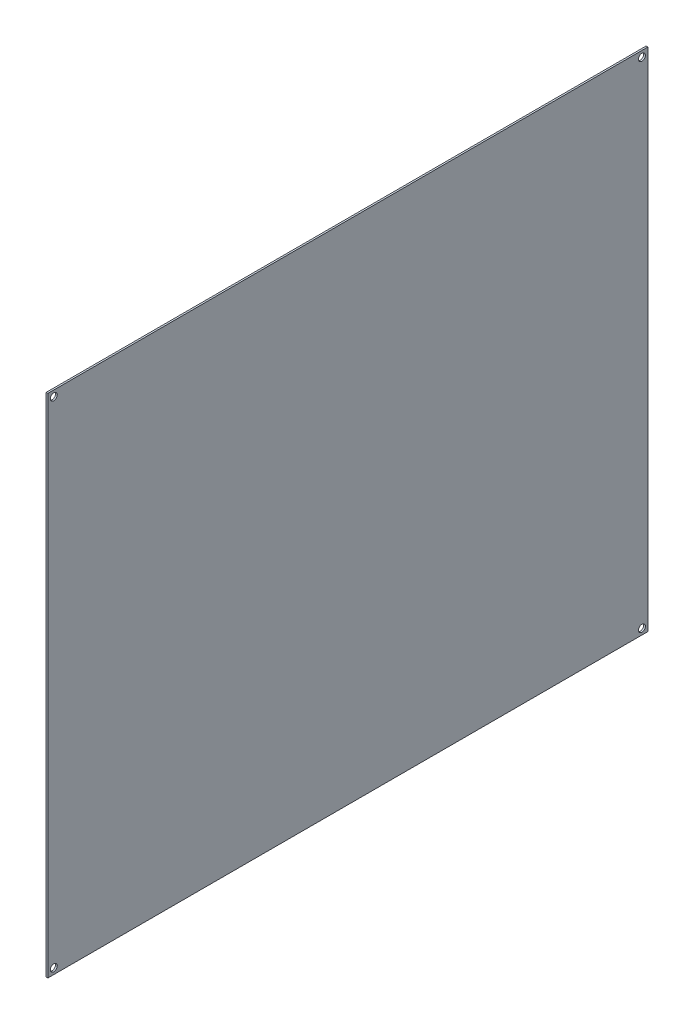
ISO-10303-21;
HEADER;
FILE_DESCRIPTION(('STEP AP214'),'2;1');
FILE_NAME('part.step','',(''),(''),'','','');
FILE_SCHEMA(('AUTOMOTIVE_DESIGN { 1 0 10303 214 1 1 1 1 }'));
ENDSEC;
DATA;
#1=APPLICATION_CONTEXT('core data for automotive mechanical design processes');
#2=APPLICATION_PROTOCOL_DEFINITION('international standard','automotive_design',2000,#1);
#3=PRODUCT_CONTEXT('',#1,'mechanical');
#4=PRODUCT('Part','Part','',(#3));
#5=PRODUCT_RELATED_PRODUCT_CATEGORY('part','',(#4));
#6=PRODUCT_DEFINITION_FORMATION('','',#4);
#7=PRODUCT_DEFINITION_CONTEXT('part definition',#1,'design');
#8=PRODUCT_DEFINITION('design','',#6,#7);
#9=PRODUCT_DEFINITION_SHAPE('','',#8);
#10=(LENGTH_UNIT() NAMED_UNIT(*) SI_UNIT(.MILLI.,.METRE.));
#11=(NAMED_UNIT(*) PLANE_ANGLE_UNIT() SI_UNIT($,.RADIAN.));
#12=(NAMED_UNIT(*) SI_UNIT($,.STERADIAN.) SOLID_ANGLE_UNIT());
#13=UNCERTAINTY_MEASURE_WITH_UNIT(LENGTH_MEASURE(1.E-05),#10,'distance_accuracy_value','');
#14=(GEOMETRIC_REPRESENTATION_CONTEXT(3) GLOBAL_UNCERTAINTY_ASSIGNED_CONTEXT((#13)) GLOBAL_UNIT_ASSIGNED_CONTEXT((#10,
#11,#12)) REPRESENTATION_CONTEXT('',''));
#15=CARTESIAN_POINT('',(0.,0.,0.));
#16=DIRECTION('',(0.,0.,1.));
#17=DIRECTION('',(1.,0.,0.));
#18=AXIS2_PLACEMENT_3D('',#15,#16,#17);
#19=CARTESIAN_POINT('',(-874.727954017006,506.100440858387,-40.1000000707061));
#20=DIRECTION('',(-1.,0.,0.));
#21=DIRECTION('',(0.,0.,1.));
#22=AXIS2_PLACEMENT_3D('',#19,#20,#21);
#23=PLANE('',#22);
#24=CARTESIAN_POINT('',(-874.727954017006,45.5410317771945,-45.54103200034));
#25=DIRECTION('',(-1.,0.,0.));
#26=DIRECTION('',(0.,0.,1.));
#27=AXIS2_PLACEMENT_3D('',#24,#25,#26);
#28=CIRCLE('',#27,3.175);
#29=CARTESIAN_POINT('',(-874.727954017006,45.5410317771945,-42.36603200034));
#30=VERTEX_POINT('',#29);
#31=EDGE_CURVE('E120',#30,#30,#28,.T.);
#32=ORIENTED_EDGE('',*,*,#31,.F.);
#33=EDGE_LOOP('',(#32));
#34=FACE_BOUND('',#33,.T.);
#35=CARTESIAN_POINT('',(-874.727954017006,500.65896799963,-586.858968152126));
#36=DIRECTION('',(-1.,0.,0.));
#37=DIRECTION('',(0.,0.,1.));
#38=AXIS2_PLACEMENT_3D('',#35,#36,#37);
#39=CIRCLE('',#38,3.17500000000008);
#40=CARTESIAN_POINT('',(-874.727954017006,500.65896799963,-583.683968152126));
#41=VERTEX_POINT('',#40);
#42=EDGE_CURVE('E99',#41,#41,#39,.T.);
#43=ORIENTED_EDGE('',*,*,#42,.F.);
#44=EDGE_LOOP('',(#43));
#45=FACE_BOUND('',#44,.T.);
#46=DIRECTION('',(0.,0.,-1.));
#47=VECTOR('',#46,1.);
#48=CARTESIAN_POINT('',(-874.727954017006,506.100440858387,-592.299999929332));
#49=LINE('',#48,#47);
#50=CARTESIAN_POINT('',(-874.727954017006,506.100440858387,-40.1000000707061));
#51=VERTEX_POINT('',#50);
#52=CARTESIAN_POINT('',(-874.727954017006,506.100440858387,-592.299999929332));
#53=VERTEX_POINT('',#52);
#54=EDGE_CURVE('E84',#51,#53,#49,.T.);
#55=ORIENTED_EDGE('',*,*,#54,.T.);
#56=DIRECTION('',(0.,-1.,0.));
#57=VECTOR('',#56,1.);
#58=CARTESIAN_POINT('',(-874.727954017006,506.100440858387,-592.299999929332));
#59=LINE('',#58,#57);
#60=CARTESIAN_POINT('',(-874.727954017006,40.0998983983221,-592.299999929332));
#61=VERTEX_POINT('',#60);
#62=EDGE_CURVE('E79',#53,#61,#59,.T.);
#63=ORIENTED_EDGE('',*,*,#62,.T.);
#64=DIRECTION('',(0.,0.,1.));
#65=VECTOR('',#64,1.);
#66=CARTESIAN_POINT('',(-874.727954017006,40.0998983983221,-592.299999929332));
#67=LINE('',#66,#65);
#68=CARTESIAN_POINT('',(-874.727954017006,40.0998983983221,-40.1000000707061));
#69=VERTEX_POINT('',#68);
#70=EDGE_CURVE('E82',#61,#69,#67,.T.);
#71=ORIENTED_EDGE('',*,*,#70,.T.);
#72=DIRECTION('',(0.,1.,0.));
#73=VECTOR('',#72,1.);
#74=CARTESIAN_POINT('',(-874.727954017006,40.0998983983221,-40.1000000707061));
#75=LINE('',#74,#73);
#76=EDGE_CURVE('E49',#69,#51,#75,.T.);
#77=ORIENTED_EDGE('',*,*,#76,.T.);
#78=EDGE_LOOP('',(#55,#63,#71,#77));
#79=FACE_BOUND('',#78,.T.);
#80=CARTESIAN_POINT('',(-874.727954017006,500.658967999659,-45.54103200034));
#81=DIRECTION('',(-1.,0.,0.));
#82=DIRECTION('',(0.,0.,1.));
#83=AXIS2_PLACEMENT_3D('',#80,#81,#82);
#84=CIRCLE('',#83,3.17500000000004);
#85=CARTESIAN_POINT('',(-874.727954017006,500.658967999659,-42.36603200034));
#86=VERTEX_POINT('',#85);
#87=EDGE_CURVE('E114',#86,#86,#84,.T.);
#88=ORIENTED_EDGE('',*,*,#87,.F.);
#89=EDGE_LOOP('',(#88));
#90=FACE_BOUND('',#89,.T.);
#91=CARTESIAN_POINT('',(-874.727954017006,45.5410317771925,-586.858968152124));
#92=DIRECTION('',(-1.,0.,0.));
#93=DIRECTION('',(0.,0.,1.));
#94=AXIS2_PLACEMENT_3D('',#91,#92,#93);
#95=CIRCLE('',#94,3.17500000002101);
#96=CARTESIAN_POINT('',(-874.727954017006,45.5410317771925,-583.683968152103));
#97=VERTEX_POINT('',#96);
#98=EDGE_CURVE('E126',#97,#97,#95,.T.);
#99=ORIENTED_EDGE('',*,*,#98,.F.);
#100=EDGE_LOOP('',(#99));
#101=FACE_BOUND('',#100,.T.);
#102=ADVANCED_FACE('F32',(#34,#45,#79,#90,#101),#23,.T.);
#103=CARTESIAN_POINT('',(-873.127754017007,506.100440858387,-40.1000000707061));
#104=DIRECTION('',(-1.,0.,0.));
#105=DIRECTION('',(0.,0.,1.));
#106=AXIS2_PLACEMENT_3D('',#103,#104,#105);
#107=PLANE('',#106);
#108=CARTESIAN_POINT('',(-873.127754017007,45.5410317771945,-45.54103200034));
#109=DIRECTION('',(-1.,0.,0.));
#110=DIRECTION('',(0.,0.,1.));
#111=AXIS2_PLACEMENT_3D('',#108,#109,#110);
#112=CIRCLE('',#111,3.175);
#113=CARTESIAN_POINT('',(-873.127754017007,45.5410317771945,-42.36603200034));
#114=VERTEX_POINT('',#113);
#115=EDGE_CURVE('E123',#114,#114,#112,.T.);
#116=ORIENTED_EDGE('',*,*,#115,.T.);
#117=EDGE_LOOP('',(#116));
#118=FACE_BOUND('',#117,.T.);
#119=CARTESIAN_POINT('',(-873.127754017006,500.65896799963,-586.858968152126));
#120=DIRECTION('',(-1.,0.,0.));
#121=DIRECTION('',(0.,0.,1.));
#122=AXIS2_PLACEMENT_3D('',#119,#120,#121);
#123=CIRCLE('',#122,3.17500000000008);
#124=CARTESIAN_POINT('',(-873.127754017006,500.65896799963,-583.683968152126));
#125=VERTEX_POINT('',#124);
#126=EDGE_CURVE('E111',#125,#125,#123,.T.);
#127=ORIENTED_EDGE('',*,*,#126,.T.);
#128=EDGE_LOOP('',(#127));
#129=FACE_BOUND('',#128,.T.);
#130=DIRECTION('',(0.,0.,-1.));
#131=VECTOR('',#130,1.);
#132=CARTESIAN_POINT('',(-873.127754017006,506.100440858387,-592.299999929332));
#133=LINE('',#132,#131);
#134=CARTESIAN_POINT('',(-873.127754017007,506.100440858387,-40.1000000707061));
#135=VERTEX_POINT('',#134);
#136=CARTESIAN_POINT('',(-873.127754017006,506.100440858387,-592.299999929332));
#137=VERTEX_POINT('',#136);
#138=EDGE_CURVE('E96',#135,#137,#133,.T.);
#139=ORIENTED_EDGE('',*,*,#138,.F.);
#140=DIRECTION('',(0.,1.,0.));
#141=VECTOR('',#140,1.);
#142=CARTESIAN_POINT('',(-873.127754017007,40.0998983983221,-40.1000000707061));
#143=LINE('',#142,#141);
#144=CARTESIAN_POINT('',(-873.127754017007,40.0998983983221,-40.1000000707061));
#145=VERTEX_POINT('',#144);
#146=EDGE_CURVE('E72',#145,#135,#143,.T.);
#147=ORIENTED_EDGE('',*,*,#146,.F.);
#148=DIRECTION('',(0.,0.,1.));
#149=VECTOR('',#148,1.);
#150=CARTESIAN_POINT('',(-873.127754017006,40.0998983983221,-592.299999929332));
#151=LINE('',#150,#149);
#152=CARTESIAN_POINT('',(-873.127754017006,40.0998983983221,-592.299999929332));
#153=VERTEX_POINT('',#152);
#154=EDGE_CURVE('E66',#153,#145,#151,.T.);
#155=ORIENTED_EDGE('',*,*,#154,.F.);
#156=DIRECTION('',(0.,-1.,0.));
#157=VECTOR('',#156,1.);
#158=CARTESIAN_POINT('',(-873.127754017006,506.100440858387,-592.299999929332));
#159=LINE('',#158,#157);
#160=EDGE_CURVE('E88',#137,#153,#159,.T.);
#161=ORIENTED_EDGE('',*,*,#160,.F.);
#162=EDGE_LOOP('',(#139,#147,#155,#161));
#163=FACE_BOUND('',#162,.T.);
#164=CARTESIAN_POINT('',(-873.127754017007,500.658967999659,-45.54103200034));
#165=DIRECTION('',(-1.,0.,0.));
#166=DIRECTION('',(0.,0.,1.));
#167=AXIS2_PLACEMENT_3D('',#164,#165,#166);
#168=CIRCLE('',#167,3.17500000000004);
#169=CARTESIAN_POINT('',(-873.127754017007,500.658967999659,-42.36603200034));
#170=VERTEX_POINT('',#169);
#171=EDGE_CURVE('E117',#170,#170,#168,.T.);
#172=ORIENTED_EDGE('',*,*,#171,.T.);
#173=EDGE_LOOP('',(#172));
#174=FACE_BOUND('',#173,.T.);
#175=CARTESIAN_POINT('',(-873.127754017006,45.5410317771925,-586.858968152124));
#176=DIRECTION('',(-1.,0.,0.));
#177=DIRECTION('',(0.,0.,1.));
#178=AXIS2_PLACEMENT_3D('',#175,#176,#177);
#179=CIRCLE('',#178,3.17500000002101);
#180=CARTESIAN_POINT('',(-873.127754017006,45.5410317771925,-583.683968152103));
#181=VERTEX_POINT('',#180);
#182=EDGE_CURVE('E129',#181,#181,#179,.T.);
#183=ORIENTED_EDGE('',*,*,#182,.T.);
#184=EDGE_LOOP('',(#183));
#185=FACE_BOUND('',#184,.T.);
#186=ADVANCED_FACE('F107',(#118,#129,#163,#174,#185),#107,.F.);
#187=CARTESIAN_POINT('',(-874.727954017006,506.100440858387,-592.299999929332));
#188=DIRECTION('',(0.,-1.,0.));
#189=DIRECTION('',(1.,0.,0.));
#190=AXIS2_PLACEMENT_3D('',#187,#188,#189);
#191=PLANE('',#190);
#192=ORIENTED_EDGE('',*,*,#138,.T.);
#193=DIRECTION('',(1.,0.,0.));
#194=VECTOR('',#193,1.);
#195=CARTESIAN_POINT('',(-874.727954017006,506.100440858387,-592.299999929332));
#196=LINE('',#195,#194);
#197=EDGE_CURVE('E11',#53,#137,#196,.T.);
#198=ORIENTED_EDGE('',*,*,#197,.F.);
#199=ORIENTED_EDGE('',*,*,#54,.F.);
#200=DIRECTION('',(1.,0.,0.));
#201=VECTOR('',#200,1.);
#202=CARTESIAN_POINT('',(-874.727954017006,506.100440858387,-40.1000000707061));
#203=LINE('',#202,#201);
#204=EDGE_CURVE('E92',#51,#135,#203,.T.);
#205=ORIENTED_EDGE('',*,*,#204,.T.);
#206=EDGE_LOOP('',(#192,#198,#199,#205));
#207=FACE_BOUND('',#206,.T.);
#208=ADVANCED_FACE('F34',(#207),#191,.F.);
#209=CARTESIAN_POINT('',(-874.727954017006,506.100440858387,-592.299999929332));
#210=DIRECTION('',(0.,0.,1.));
#211=DIRECTION('',(1.,0.,0.));
#212=AXIS2_PLACEMENT_3D('',#209,#210,#211);
#213=PLANE('',#212);
#214=ORIENTED_EDGE('',*,*,#160,.T.);
#215=DIRECTION('',(1.,0.,0.));
#216=VECTOR('',#215,1.);
#217=CARTESIAN_POINT('',(-874.727954017006,40.0998983983221,-592.299999929332));
#218=LINE('',#217,#216);
#219=EDGE_CURVE('E41',#61,#153,#218,.T.);
#220=ORIENTED_EDGE('',*,*,#219,.F.);
#221=ORIENTED_EDGE('',*,*,#62,.F.);
#222=ORIENTED_EDGE('',*,*,#197,.T.);
#223=EDGE_LOOP('',(#214,#220,#221,#222));
#224=FACE_BOUND('',#223,.T.);
#225=ADVANCED_FACE('F87',(#224),#213,.F.);
#226=CARTESIAN_POINT('',(-874.727954017006,40.0998983983221,-592.299999929332));
#227=DIRECTION('',(0.,1.,0.));
#228=DIRECTION('',(0.,0.,1.));
#229=AXIS2_PLACEMENT_3D('',#226,#227,#228);
#230=PLANE('',#229);
#231=ORIENTED_EDGE('',*,*,#154,.T.);
#232=DIRECTION('',(1.,0.,0.));
#233=VECTOR('',#232,1.);
#234=CARTESIAN_POINT('',(-874.727954017006,40.0998983983221,-40.1000000707061));
#235=LINE('',#234,#233);
#236=EDGE_CURVE('E89',#69,#145,#235,.T.);
#237=ORIENTED_EDGE('',*,*,#236,.F.);
#238=ORIENTED_EDGE('',*,*,#70,.F.);
#239=ORIENTED_EDGE('',*,*,#219,.T.);
#240=EDGE_LOOP('',(#231,#237,#238,#239));
#241=FACE_BOUND('',#240,.T.);
#242=ADVANCED_FACE('F90',(#241),#230,.F.);
#243=CARTESIAN_POINT('',(-874.727954017006,40.0998983983221,-40.1000000707061));
#244=DIRECTION('',(0.,0.,-1.));
#245=DIRECTION('',(-1.,0.,0.));
#246=AXIS2_PLACEMENT_3D('',#243,#244,#245);
#247=PLANE('',#246);
#248=ORIENTED_EDGE('',*,*,#146,.T.);
#249=ORIENTED_EDGE('',*,*,#204,.F.);
#250=ORIENTED_EDGE('',*,*,#76,.F.);
#251=ORIENTED_EDGE('',*,*,#236,.T.);
#252=EDGE_LOOP('',(#248,#249,#250,#251));
#253=FACE_BOUND('',#252,.T.);
#254=ADVANCED_FACE('F104',(#253),#247,.F.);
#255=CARTESIAN_POINT('',(-874.727954017006,500.65896799963,-586.858968152126));
#256=DIRECTION('',(1.,0.,0.));
#257=DIRECTION('',(0.,0.,-1.));
#258=AXIS2_PLACEMENT_3D('',#255,#256,#257);
#259=CYLINDRICAL_SURFACE('',#258,3.17500000000008);
#260=ORIENTED_EDGE('',*,*,#42,.T.);
#261=EDGE_LOOP('',(#260));
#262=FACE_BOUND('',#261,.T.);
#263=ORIENTED_EDGE('',*,*,#126,.F.);
#264=EDGE_LOOP('',(#263));
#265=FACE_BOUND('',#264,.T.);
#266=ADVANCED_FACE('F149',(#262,#265),#259,.F.);
#267=CARTESIAN_POINT('',(-874.727954017006,500.658967999659,-45.54103200034));
#268=DIRECTION('',(1.,0.,0.));
#269=DIRECTION('',(0.,0.,-1.));
#270=AXIS2_PLACEMENT_3D('',#267,#268,#269);
#271=CYLINDRICAL_SURFACE('',#270,3.17500000000004);
#272=ORIENTED_EDGE('',*,*,#87,.T.);
#273=EDGE_LOOP('',(#272));
#274=FACE_BOUND('',#273,.T.);
#275=ORIENTED_EDGE('',*,*,#171,.F.);
#276=EDGE_LOOP('',(#275));
#277=FACE_BOUND('',#276,.T.);
#278=ADVANCED_FACE('F195',(#274,#277),#271,.F.);
#279=CARTESIAN_POINT('',(-874.727954017006,45.5410317771945,-45.54103200034));
#280=DIRECTION('',(1.,0.,0.));
#281=DIRECTION('',(0.,0.,-1.));
#282=AXIS2_PLACEMENT_3D('',#279,#280,#281);
#283=CYLINDRICAL_SURFACE('',#282,3.175);
#284=ORIENTED_EDGE('',*,*,#31,.T.);
#285=EDGE_LOOP('',(#284));
#286=FACE_BOUND('',#285,.T.);
#287=ORIENTED_EDGE('',*,*,#115,.F.);
#288=EDGE_LOOP('',(#287));
#289=FACE_BOUND('',#288,.T.);
#290=ADVANCED_FACE('F203',(#286,#289),#283,.F.);
#291=CARTESIAN_POINT('',(-874.727954017006,45.5410317771925,-586.858968152124));
#292=DIRECTION('',(1.,0.,0.));
#293=DIRECTION('',(0.,0.,-1.));
#294=AXIS2_PLACEMENT_3D('',#291,#292,#293);
#295=CYLINDRICAL_SURFACE('',#294,3.17500000002101);
#296=ORIENTED_EDGE('',*,*,#98,.T.);
#297=EDGE_LOOP('',(#296));
#298=FACE_BOUND('',#297,.T.);
#299=ORIENTED_EDGE('',*,*,#182,.F.);
#300=EDGE_LOOP('',(#299));
#301=FACE_BOUND('',#300,.T.);
#302=ADVANCED_FACE('F135',(#298,#301),#295,.F.);
#303=CLOSED_SHELL('',(#102,#186,#208,#225,#242,#254,#266,#278,#290,#302));
#304=MANIFOLD_SOLID_BREP('B2',#303);
#305=ADVANCED_BREP_SHAPE_REPRESENTATION('',(#18,#304),#14);
#306=SHAPE_DEFINITION_REPRESENTATION(#9,#305);
ENDSEC;
END-ISO-10303-21;
